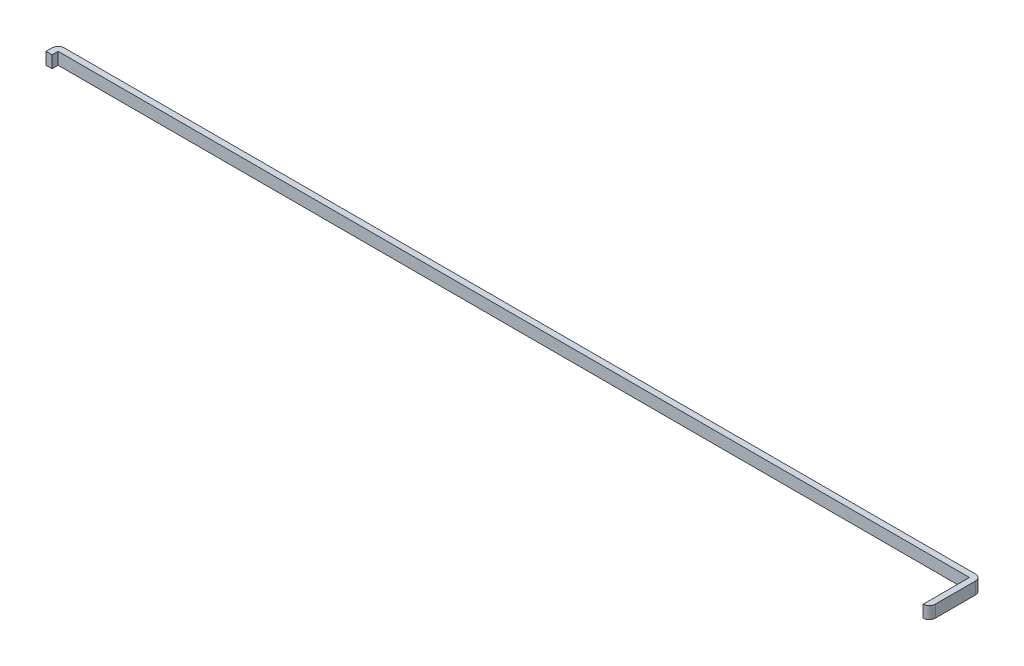
ISO-10303-21;
HEADER;
FILE_DESCRIPTION(('STEP AP214'),'2;1');
FILE_NAME('part.step','',(''),(''),'','','');
FILE_SCHEMA(('AUTOMOTIVE_DESIGN { 1 0 10303 214 1 1 1 1 }'));
ENDSEC;
DATA;
#1=APPLICATION_CONTEXT('core data for automotive mechanical design processes');
#2=APPLICATION_PROTOCOL_DEFINITION('international standard','automotive_design',2000,#1);
#3=PRODUCT_CONTEXT('',#1,'mechanical');
#4=PRODUCT('Part','Part','',(#3));
#5=PRODUCT_RELATED_PRODUCT_CATEGORY('part','',(#4));
#6=PRODUCT_DEFINITION_FORMATION('','',#4);
#7=PRODUCT_DEFINITION_CONTEXT('part definition',#1,'design');
#8=PRODUCT_DEFINITION('design','',#6,#7);
#9=PRODUCT_DEFINITION_SHAPE('','',#8);
#10=(LENGTH_UNIT() NAMED_UNIT(*) SI_UNIT(.MILLI.,.METRE.));
#11=(NAMED_UNIT(*) PLANE_ANGLE_UNIT() SI_UNIT($,.RADIAN.));
#12=(NAMED_UNIT(*) SI_UNIT($,.STERADIAN.) SOLID_ANGLE_UNIT());
#13=UNCERTAINTY_MEASURE_WITH_UNIT(LENGTH_MEASURE(1.E-05),#10,'distance_accuracy_value','');
#14=(GEOMETRIC_REPRESENTATION_CONTEXT(3) GLOBAL_UNCERTAINTY_ASSIGNED_CONTEXT((#13)) GLOBAL_UNIT_ASSIGNED_CONTEXT((#10,
#11,#12)) REPRESENTATION_CONTEXT('',''));
#15=CARTESIAN_POINT('',(0.,0.,0.));
#16=DIRECTION('',(0.,0.,1.));
#17=DIRECTION('',(1.,0.,0.));
#18=AXIS2_PLACEMENT_3D('',#15,#16,#17);
#19=CARTESIAN_POINT('',(-15.025,-1.00619,0.20019));
#20=DIRECTION('',(0.,0.,-1.));
#21=DIRECTION('',(-1.,0.,0.));
#22=AXIS2_PLACEMENT_3D('',#19,#20,#21);
#23=PLANE('',#22);
#24=DIRECTION('',(0.,1.,0.));
#25=VECTOR('',#24,1.);
#26=CARTESIAN_POINT('',(15.035,-1.00619,0.20019));
#27=LINE('',#26,#25);
#28=CARTESIAN_POINT('',(15.035,-1.00619,0.20019));
#29=VERTEX_POINT('',#28);
#30=CARTESIAN_POINT('',(15.035,-0.60581,0.20019));
#31=VERTEX_POINT('',#30);
#32=EDGE_CURVE('E125',#29,#31,#27,.T.);
#33=ORIENTED_EDGE('',*,*,#32,.T.);
#34=DIRECTION('',(1.,0.,0.));
#35=VECTOR('',#34,1.);
#36=CARTESIAN_POINT('',(15.035,-0.60581,0.20019));
#37=LINE('',#36,#35);
#38=CARTESIAN_POINT('',(-15.025,-0.60581,0.20019));
#39=VERTEX_POINT('',#38);
#40=EDGE_CURVE('E112',#31,#39,#37,.F.);
#41=ORIENTED_EDGE('',*,*,#40,.T.);
#42=DIRECTION('',(0.,1.,0.));
#43=VECTOR('',#42,1.);
#44=CARTESIAN_POINT('',(-15.025,-1.00619,0.20019));
#45=LINE('',#44,#43);
#46=CARTESIAN_POINT('',(-15.025,-1.00619,0.20019));
#47=VERTEX_POINT('',#46);
#48=EDGE_CURVE('E108',#39,#47,#45,.F.);
#49=ORIENTED_EDGE('',*,*,#48,.T.);
#50=DIRECTION('',(1.,0.,0.));
#51=VECTOR('',#50,1.);
#52=CARTESIAN_POINT('',(15.035,-1.00619,0.20019));
#53=LINE('',#52,#51);
#54=EDGE_CURVE('E126',#29,#47,#53,.F.);
#55=ORIENTED_EDGE('',*,*,#54,.F.);
#56=EDGE_LOOP('',(#33,#41,#49,#55));
#57=FACE_BOUND('',#56,.T.);
#58=ADVANCED_FACE('F17',(#57),#23,.F.);
#59=CARTESIAN_POINT('',(-15.025,-1.00619,0.40038));
#60=DIRECTION('',(-1.,0.,0.));
#61=DIRECTION('',(0.,0.,1.));
#62=AXIS2_PLACEMENT_3D('',#59,#60,#61);
#63=PLANE('',#62);
#64=ORIENTED_EDGE('',*,*,#48,.F.);
#65=DIRECTION('',(0.,0.,-1.));
#66=VECTOR('',#65,1.);
#67=CARTESIAN_POINT('',(-15.025,-0.60581,0.20019));
#68=LINE('',#67,#66);
#69=CARTESIAN_POINT('',(-15.025,-0.60581,0.40038));
#70=VERTEX_POINT('',#69);
#71=EDGE_CURVE('E120',#39,#70,#68,.F.);
#72=ORIENTED_EDGE('',*,*,#71,.T.);
#73=DIRECTION('',(0.,1.,0.));
#74=VECTOR('',#73,1.);
#75=CARTESIAN_POINT('',(-15.025,-1.00619,0.40038));
#76=LINE('',#75,#74);
#77=CARTESIAN_POINT('',(-15.025,-1.00619,0.40038));
#78=VERTEX_POINT('',#77);
#79=EDGE_CURVE('E177',#70,#78,#76,.F.);
#80=ORIENTED_EDGE('',*,*,#79,.T.);
#81=DIRECTION('',(0.,0.,-1.));
#82=VECTOR('',#81,1.);
#83=CARTESIAN_POINT('',(-15.025,-1.00619,0.20019));
#84=LINE('',#83,#82);
#85=EDGE_CURVE('E168',#47,#78,#84,.F.);
#86=ORIENTED_EDGE('',*,*,#85,.F.);
#87=EDGE_LOOP('',(#64,#72,#80,#86));
#88=FACE_BOUND('',#87,.T.);
#89=ADVANCED_FACE('F227',(#88),#63,.F.);
#90=CARTESIAN_POINT('',(-15.22519,-1.00619,0.40038));
#91=DIRECTION('',(0.,0.,-1.));
#92=DIRECTION('',(-1.,0.,0.));
#93=AXIS2_PLACEMENT_3D('',#90,#91,#92);
#94=PLANE('',#93);
#95=ORIENTED_EDGE('',*,*,#79,.F.);
#96=DIRECTION('',(1.,0.,0.));
#97=VECTOR('',#96,1.);
#98=CARTESIAN_POINT('',(15.035,-0.60581,0.40038));
#99=LINE('',#98,#97);
#100=CARTESIAN_POINT('',(-15.22519,-0.60581,0.40038));
#101=VERTEX_POINT('',#100);
#102=EDGE_CURVE('E145',#70,#101,#99,.F.);
#103=ORIENTED_EDGE('',*,*,#102,.T.);
#104=DIRECTION('',(0.,1.,0.));
#105=VECTOR('',#104,1.);
#106=CARTESIAN_POINT('',(-15.22519,-1.00619,0.40038));
#107=LINE('',#106,#105);
#108=CARTESIAN_POINT('',(-15.22519,-1.00619,0.40038));
#109=VERTEX_POINT('',#108);
#110=EDGE_CURVE('E184',#101,#109,#107,.F.);
#111=ORIENTED_EDGE('',*,*,#110,.T.);
#112=DIRECTION('',(1.,0.,0.));
#113=VECTOR('',#112,1.);
#114=CARTESIAN_POINT('',(15.035,-1.00619,0.40038));
#115=LINE('',#114,#113);
#116=EDGE_CURVE('E86',#78,#109,#115,.F.);
#117=ORIENTED_EDGE('',*,*,#116,.F.);
#118=EDGE_LOOP('',(#95,#103,#111,#117));
#119=FACE_BOUND('',#118,.T.);
#120=ADVANCED_FACE('F226',(#119),#94,.F.);
#121=CARTESIAN_POINT('',(-15.22519,-1.00619,0.20019));
#122=DIRECTION('',(1.,0.,0.));
#123=DIRECTION('',(0.,0.,-1.));
#124=AXIS2_PLACEMENT_3D('',#121,#122,#123);
#125=PLANE('',#124);
#126=ORIENTED_EDGE('',*,*,#110,.F.);
#127=DIRECTION('',(0.,0.,-1.));
#128=VECTOR('',#127,1.);
#129=CARTESIAN_POINT('',(-15.22519,-0.60581,0.20019));
#130=LINE('',#129,#128);
#131=CARTESIAN_POINT('',(-15.22519,-0.60581,0.20019));
#132=VERTEX_POINT('',#131);
#133=EDGE_CURVE('E148',#101,#132,#130,.T.);
#134=ORIENTED_EDGE('',*,*,#133,.T.);
#135=DIRECTION('',(0.,-1.,0.));
#136=VECTOR('',#135,1.);
#137=CARTESIAN_POINT('',(-15.22519,-1.00619,0.20019));
#138=LINE('',#137,#136);
#139=CARTESIAN_POINT('',(-15.22519,-1.00619,0.20019));
#140=VERTEX_POINT('',#139);
#141=EDGE_CURVE('E134',#140,#132,#138,.F.);
#142=ORIENTED_EDGE('',*,*,#141,.F.);
#143=DIRECTION('',(0.,0.,-1.));
#144=VECTOR('',#143,1.);
#145=CARTESIAN_POINT('',(-15.22519,-1.00619,0.20019));
#146=LINE('',#145,#144);
#147=EDGE_CURVE('E80',#109,#140,#146,.T.);
#148=ORIENTED_EDGE('',*,*,#147,.F.);
#149=EDGE_LOOP('',(#126,#134,#142,#148));
#150=FACE_BOUND('',#149,.T.);
#151=ADVANCED_FACE('F224',(#150),#125,.F.);
#152=CARTESIAN_POINT('',(15.23519,-1.00619,1.524905));
#153=DIRECTION('',(-1.,0.,0.));
#154=DIRECTION('',(0.,0.,1.));
#155=AXIS2_PLACEMENT_3D('',#152,#153,#154);
#156=PLANE('',#155);
#157=DIRECTION('',(0.,-1.,0.));
#158=VECTOR('',#157,1.);
#159=CARTESIAN_POINT('',(15.23519,-1.00619,0.20019));
#160=LINE('',#159,#158);
#161=CARTESIAN_POINT('',(15.23519,-0.60581,0.20019));
#162=VERTEX_POINT('',#161);
#163=CARTESIAN_POINT('',(15.23519,-1.00619,0.20019));
#164=VERTEX_POINT('',#163);
#165=EDGE_CURVE('E74',#162,#164,#160,.T.);
#166=ORIENTED_EDGE('',*,*,#165,.F.);
#167=DIRECTION('',(0.,0.,-1.));
#168=VECTOR('',#167,1.);
#169=CARTESIAN_POINT('',(15.23519,-0.60581,0.20019));
#170=LINE('',#169,#168);
#171=CARTESIAN_POINT('',(15.23519,-0.60581,1.524905));
#172=VERTEX_POINT('',#171);
#173=EDGE_CURVE('E139',#162,#172,#170,.F.);
#174=ORIENTED_EDGE('',*,*,#173,.T.);
#175=DIRECTION('',(0.,-1.,0.));
#176=VECTOR('',#175,1.);
#177=CARTESIAN_POINT('',(15.23519,-1.00619,1.524905));
#178=LINE('',#177,#176);
#179=CARTESIAN_POINT('',(15.23519,-1.00619,1.524905));
#180=VERTEX_POINT('',#179);
#181=EDGE_CURVE('E190',#180,#172,#178,.F.);
#182=ORIENTED_EDGE('',*,*,#181,.F.);
#183=DIRECTION('',(0.,0.,-1.));
#184=VECTOR('',#183,1.);
#185=CARTESIAN_POINT('',(15.23519,-1.00619,0.20019));
#186=LINE('',#185,#184);
#187=EDGE_CURVE('E160',#164,#180,#186,.F.);
#188=ORIENTED_EDGE('',*,*,#187,.F.);
#189=EDGE_LOOP('',(#166,#174,#182,#188));
#190=FACE_BOUND('',#189,.T.);
#191=ADVANCED_FACE('F216',(#190),#156,.F.);
#192=CARTESIAN_POINT('',(15.035,-1.00619,1.524905));
#193=DIRECTION('',(0.,-1.,0.));
#194=DIRECTION('',(0.,0.,-1.));
#195=AXIS2_PLACEMENT_3D('',#192,#193,#194);
#196=CYLINDRICAL_SURFACE('',#195,0.20019);
#197=CARTESIAN_POINT('',(15.035,-0.60581,1.524905));
#198=DIRECTION('',(0.,-1.,0.));
#199=DIRECTION('',(0.,0.,-1.));
#200=AXIS2_PLACEMENT_3D('',#197,#198,#199);
#201=CIRCLE('',#200,0.20019);
#202=CARTESIAN_POINT('',(15.035,-0.60581,1.725095));
#203=VERTEX_POINT('',#202);
#204=EDGE_CURVE('E135',#172,#203,#201,.T.);
#205=ORIENTED_EDGE('',*,*,#204,.T.);
#206=DIRECTION('',(0.,1.,0.));
#207=VECTOR('',#206,1.);
#208=CARTESIAN_POINT('',(15.035,-1.00619,1.725095));
#209=LINE('',#208,#207);
#210=CARTESIAN_POINT('',(15.035,-1.00619,1.725095));
#211=VERTEX_POINT('',#210);
#212=EDGE_CURVE('E129',#203,#211,#209,.F.);
#213=ORIENTED_EDGE('',*,*,#212,.T.);
#214=CARTESIAN_POINT('',(15.035,-1.00619,1.524905));
#215=DIRECTION('',(0.,-1.,0.));
#216=DIRECTION('',(0.,0.,-1.));
#217=AXIS2_PLACEMENT_3D('',#214,#215,#216);
#218=CIRCLE('',#217,0.20019);
#219=EDGE_CURVE('E156',#180,#211,#218,.T.);
#220=ORIENTED_EDGE('',*,*,#219,.F.);
#221=ORIENTED_EDGE('',*,*,#181,.T.);
#222=EDGE_LOOP('',(#205,#213,#220,#221));
#223=FACE_BOUND('',#222,.T.);
#224=ADVANCED_FACE('F218',(#223),#196,.T.);
#225=CARTESIAN_POINT('',(15.035,-1.00619,0.20019));
#226=DIRECTION('',(1.,0.,0.));
#227=DIRECTION('',(0.,0.,-1.));
#228=AXIS2_PLACEMENT_3D('',#225,#226,#227);
#229=PLANE('',#228);
#230=DIRECTION('',(0.,0.,-1.));
#231=VECTOR('',#230,1.);
#232=CARTESIAN_POINT('',(15.035,-1.00619,0.20019));
#233=LINE('',#232,#231);
#234=EDGE_CURVE('E159',#211,#29,#233,.T.);
#235=ORIENTED_EDGE('',*,*,#234,.F.);
#236=ORIENTED_EDGE('',*,*,#212,.F.);
#237=DIRECTION('',(0.,0.,-1.));
#238=VECTOR('',#237,1.);
#239=CARTESIAN_POINT('',(15.035,-0.60581,0.20019));
#240=LINE('',#239,#238);
#241=EDGE_CURVE('E117',#203,#31,#240,.T.);
#242=ORIENTED_EDGE('',*,*,#241,.T.);
#243=ORIENTED_EDGE('',*,*,#32,.F.);
#244=EDGE_LOOP('',(#235,#236,#242,#243));
#245=FACE_BOUND('',#244,.T.);
#246=ADVANCED_FACE('F131',(#245),#229,.F.);
#247=CARTESIAN_POINT('',(15.035,-1.00619,0.20019));
#248=DIRECTION('',(0.,-1.,0.));
#249=DIRECTION('',(0.,0.,-1.));
#250=AXIS2_PLACEMENT_3D('',#247,#248,#249);
#251=CYLINDRICAL_SURFACE('',#250,0.20019);
#252=CARTESIAN_POINT('',(15.035,-0.60581,0.20019));
#253=DIRECTION('',(0.,-1.,0.));
#254=DIRECTION('',(0.,0.,-1.));
#255=AXIS2_PLACEMENT_3D('',#252,#253,#254);
#256=CIRCLE('',#255,0.20019);
#257=CARTESIAN_POINT('',(15.035,-0.60581,0.));
#258=VERTEX_POINT('',#257);
#259=EDGE_CURVE('E20',#258,#162,#256,.T.);
#260=ORIENTED_EDGE('',*,*,#259,.T.);
#261=ORIENTED_EDGE('',*,*,#165,.T.);
#262=CARTESIAN_POINT('',(15.035,-1.00619,0.20019));
#263=DIRECTION('',(0.,-1.,0.));
#264=DIRECTION('',(0.,0.,-1.));
#265=AXIS2_PLACEMENT_3D('',#262,#263,#264);
#266=CIRCLE('',#265,0.20019);
#267=CARTESIAN_POINT('',(15.035,-1.00619,0.));
#268=VERTEX_POINT('',#267);
#269=EDGE_CURVE('E161',#268,#164,#266,.T.);
#270=ORIENTED_EDGE('',*,*,#269,.F.);
#271=DIRECTION('',(0.,1.,0.));
#272=VECTOR('',#271,1.);
#273=CARTESIAN_POINT('',(15.035,-1.00619,0.));
#274=LINE('',#273,#272);
#275=EDGE_CURVE('E64',#268,#258,#274,.T.);
#276=ORIENTED_EDGE('',*,*,#275,.T.);
#277=EDGE_LOOP('',(#260,#261,#270,#276));
#278=FACE_BOUND('',#277,.T.);
#279=ADVANCED_FACE('F219',(#278),#251,.T.);
#280=CARTESIAN_POINT('',(15.035,-0.60581,0.20019));
#281=DIRECTION('',(0.,-1.,0.));
#282=DIRECTION('',(0.,0.,-1.));
#283=AXIS2_PLACEMENT_3D('',#280,#281,#282);
#284=PLANE('',#283);
#285=ORIENTED_EDGE('',*,*,#241,.F.);
#286=ORIENTED_EDGE('',*,*,#204,.F.);
#287=ORIENTED_EDGE('',*,*,#173,.F.);
#288=ORIENTED_EDGE('',*,*,#259,.F.);
#289=DIRECTION('',(1.,0.,0.));
#290=VECTOR('',#289,1.);
#291=CARTESIAN_POINT('',(15.035,-0.60581,0.));
#292=LINE('',#291,#290);
#293=CARTESIAN_POINT('',(-15.025,-0.60581,0.));
#294=VERTEX_POINT('',#293);
#295=EDGE_CURVE('E204',#258,#294,#292,.F.);
#296=ORIENTED_EDGE('',*,*,#295,.T.);
#297=CARTESIAN_POINT('',(-15.025,-0.60581,0.20019));
#298=DIRECTION('',(0.,-1.,0.));
#299=DIRECTION('',(0.,0.,-1.));
#300=AXIS2_PLACEMENT_3D('',#297,#298,#299);
#301=CIRCLE('',#300,0.20019);
#302=EDGE_CURVE('E137',#132,#294,#301,.T.);
#303=ORIENTED_EDGE('',*,*,#302,.F.);
#304=ORIENTED_EDGE('',*,*,#133,.F.);
#305=ORIENTED_EDGE('',*,*,#102,.F.);
#306=ORIENTED_EDGE('',*,*,#71,.F.);
#307=ORIENTED_EDGE('',*,*,#40,.F.);
#308=EDGE_LOOP('',(#285,#286,#287,#288,#296,#303,#304,#305,#306,#307));
#309=FACE_BOUND('',#308,.T.);
#310=ADVANCED_FACE('F114',(#309),#284,.F.);
#311=CARTESIAN_POINT('',(-15.025,-1.00619,0.20019));
#312=DIRECTION('',(0.,-1.,0.));
#313=DIRECTION('',(0.,0.,-1.));
#314=AXIS2_PLACEMENT_3D('',#311,#312,#313);
#315=CYLINDRICAL_SURFACE('',#314,0.20019);
#316=ORIENTED_EDGE('',*,*,#302,.T.);
#317=DIRECTION('',(0.,1.,0.));
#318=VECTOR('',#317,1.);
#319=CARTESIAN_POINT('',(-15.025,-1.00619,0.));
#320=LINE('',#319,#318);
#321=CARTESIAN_POINT('',(-15.025,-1.00619,0.));
#322=VERTEX_POINT('',#321);
#323=EDGE_CURVE('E26',#294,#322,#320,.F.);
#324=ORIENTED_EDGE('',*,*,#323,.T.);
#325=CARTESIAN_POINT('',(-15.025,-1.00619,0.20019));
#326=DIRECTION('',(0.,-1.,0.));
#327=DIRECTION('',(0.,0.,-1.));
#328=AXIS2_PLACEMENT_3D('',#325,#326,#327);
#329=CIRCLE('',#328,0.20019);
#330=EDGE_CURVE('E34',#140,#322,#329,.T.);
#331=ORIENTED_EDGE('',*,*,#330,.F.);
#332=ORIENTED_EDGE('',*,*,#141,.T.);
#333=EDGE_LOOP('',(#316,#324,#331,#332));
#334=FACE_BOUND('',#333,.T.);
#335=ADVANCED_FACE('F221',(#334),#315,.T.);
#336=CARTESIAN_POINT('',(15.035,-1.00619,0.20019));
#337=DIRECTION('',(0.,-1.,0.));
#338=DIRECTION('',(0.,0.,-1.));
#339=AXIS2_PLACEMENT_3D('',#336,#337,#338);
#340=PLANE('',#339);
#341=ORIENTED_EDGE('',*,*,#219,.T.);
#342=ORIENTED_EDGE('',*,*,#234,.T.);
#343=ORIENTED_EDGE('',*,*,#54,.T.);
#344=ORIENTED_EDGE('',*,*,#85,.T.);
#345=ORIENTED_EDGE('',*,*,#116,.T.);
#346=ORIENTED_EDGE('',*,*,#147,.T.);
#347=ORIENTED_EDGE('',*,*,#330,.T.);
#348=DIRECTION('',(1.,0.,0.));
#349=VECTOR('',#348,1.);
#350=CARTESIAN_POINT('',(15.035,-1.00619,0.));
#351=LINE('',#350,#349);
#352=EDGE_CURVE('E11',#322,#268,#351,.T.);
#353=ORIENTED_EDGE('',*,*,#352,.T.);
#354=ORIENTED_EDGE('',*,*,#269,.T.);
#355=ORIENTED_EDGE('',*,*,#187,.T.);
#356=EDGE_LOOP('',(#341,#342,#343,#344,#345,#346,#347,#353,#354,#355));
#357=FACE_BOUND('',#356,.T.);
#358=ADVANCED_FACE('F213',(#357),#340,.T.);
#359=CARTESIAN_POINT('',(15.035,-1.00619,0.));
#360=DIRECTION('',(0.,0.,1.));
#361=DIRECTION('',(1.,0.,0.));
#362=AXIS2_PLACEMENT_3D('',#359,#360,#361);
#363=PLANE('',#362);
#364=ORIENTED_EDGE('',*,*,#323,.F.);
#365=ORIENTED_EDGE('',*,*,#295,.F.);
#366=ORIENTED_EDGE('',*,*,#275,.F.);
#367=ORIENTED_EDGE('',*,*,#352,.F.);
#368=EDGE_LOOP('',(#364,#365,#366,#367));
#369=FACE_BOUND('',#368,.T.);
#370=ADVANCED_FACE('F220',(#369),#363,.F.);
#371=CLOSED_SHELL('',(#58,#89,#120,#151,#191,#224,#246,#279,#310,#335,#358,#370));
#372=MANIFOLD_SOLID_BREP('B1',#371);
#373=ADVANCED_BREP_SHAPE_REPRESENTATION('',(#18,#372),#14);
#374=SHAPE_DEFINITION_REPRESENTATION(#9,#373);
ENDSEC;
END-ISO-10303-21;
